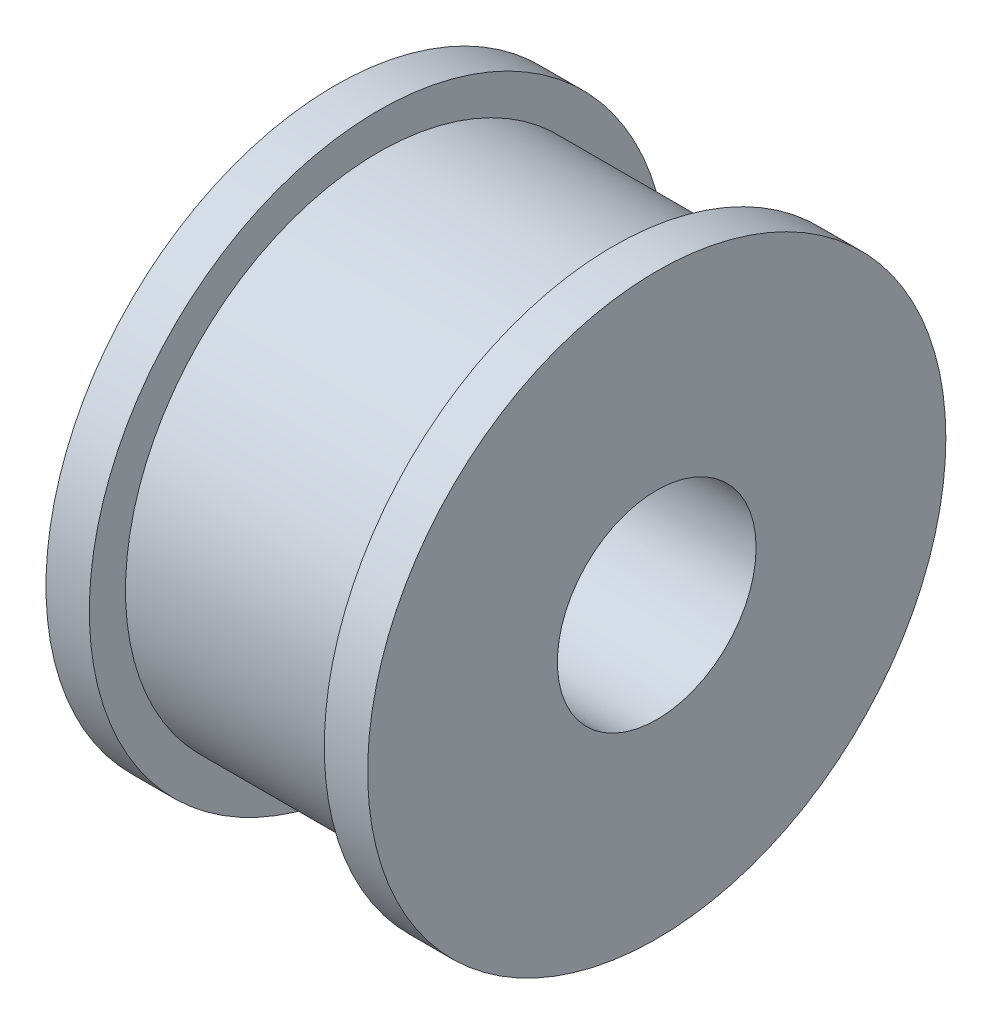
ISO-10303-21;
HEADER;
FILE_DESCRIPTION(('STEP AP214'),'2;1');
FILE_NAME('part.step','',(''),(''),'','','');
FILE_SCHEMA(('AUTOMOTIVE_DESIGN { 1 0 10303 214 1 1 1 1 }'));
ENDSEC;
DATA;
#1=APPLICATION_CONTEXT('core data for automotive mechanical design processes');
#2=APPLICATION_PROTOCOL_DEFINITION('international standard','automotive_design',2000,#1);
#3=PRODUCT_CONTEXT('',#1,'mechanical');
#4=PRODUCT('Part','Part','',(#3));
#5=PRODUCT_RELATED_PRODUCT_CATEGORY('part','',(#4));
#6=PRODUCT_DEFINITION_FORMATION('','',#4);
#7=PRODUCT_DEFINITION_CONTEXT('part definition',#1,'design');
#8=PRODUCT_DEFINITION('design','',#6,#7);
#9=PRODUCT_DEFINITION_SHAPE('','',#8);
#10=(LENGTH_UNIT() NAMED_UNIT(*) SI_UNIT(.MILLI.,.METRE.));
#11=(NAMED_UNIT(*) PLANE_ANGLE_UNIT() SI_UNIT($,.RADIAN.));
#12=(NAMED_UNIT(*) SI_UNIT($,.STERADIAN.) SOLID_ANGLE_UNIT());
#13=UNCERTAINTY_MEASURE_WITH_UNIT(LENGTH_MEASURE(1.E-05),#10,'distance_accuracy_value','');
#14=(GEOMETRIC_REPRESENTATION_CONTEXT(3) GLOBAL_UNCERTAINTY_ASSIGNED_CONTEXT((#13)) GLOBAL_UNIT_ASSIGNED_CONTEXT((#10,
#11,#12)) REPRESENTATION_CONTEXT('',''));
#15=CARTESIAN_POINT('',(0.,0.,0.));
#16=DIRECTION('',(0.,0.,1.));
#17=DIRECTION('',(1.,0.,0.));
#18=AXIS2_PLACEMENT_3D('',#15,#16,#17);
#19=CARTESIAN_POINT('',(-44.5,0.,0.));
#20=DIRECTION('',(-1.,0.,0.));
#21=DIRECTION('',(0.,0.,1.));
#22=AXIS2_PLACEMENT_3D('',#19,#20,#21);
#23=PLANE('',#22);
#24=CARTESIAN_POINT('',(-44.5,0.,0.));
#25=DIRECTION('',(-1.,0.,0.));
#26=DIRECTION('',(0.,0.,1.));
#27=AXIS2_PLACEMENT_3D('',#24,#25,#26);
#28=CIRCLE('',#27,27.5);
#29=CARTESIAN_POINT('',(-44.5,0.,27.5));
#30=VERTEX_POINT('',#29);
#31=EDGE_CURVE('E68',#30,#30,#28,.T.);
#32=ORIENTED_EDGE('',*,*,#31,.F.);
#33=EDGE_LOOP('',(#32));
#34=FACE_BOUND('',#33,.T.);
#35=CARTESIAN_POINT('',(-44.5,0.,0.));
#36=DIRECTION('',(1.,0.,0.));
#37=DIRECTION('',(0.,0.,-1.));
#38=AXIS2_PLACEMENT_3D('',#35,#36,#37);
#39=CIRCLE('',#38,80.);
#40=CARTESIAN_POINT('',(-44.5,0.,-80.));
#41=VERTEX_POINT('',#40);
#42=EDGE_CURVE('E10',#41,#41,#39,.T.);
#43=ORIENTED_EDGE('',*,*,#42,.F.);
#44=EDGE_LOOP('',(#43));
#45=FACE_BOUND('',#44,.T.);
#46=ADVANCED_FACE('F37',(#34,#45),#23,.T.);
#47=CARTESIAN_POINT('',(44.5,0.,0.));
#48=DIRECTION('',(1.,0.,0.));
#49=DIRECTION('',(0.,0.,-1.));
#50=AXIS2_PLACEMENT_3D('',#47,#48,#49);
#51=CYLINDRICAL_SURFACE('',#50,80.);
#52=ORIENTED_EDGE('',*,*,#42,.T.);
#53=EDGE_LOOP('',(#52));
#54=FACE_BOUND('',#53,.T.);
#55=CARTESIAN_POINT('',(-32.5,0.,0.));
#56=DIRECTION('',(1.,0.,0.));
#57=DIRECTION('',(0.,0.,-1.));
#58=AXIS2_PLACEMENT_3D('',#55,#56,#57);
#59=CIRCLE('',#58,80.);
#60=CARTESIAN_POINT('',(-32.5,0.,-80.));
#61=VERTEX_POINT('',#60);
#62=EDGE_CURVE('E45',#61,#61,#59,.T.);
#63=ORIENTED_EDGE('',*,*,#62,.F.);
#64=EDGE_LOOP('',(#63));
#65=FACE_BOUND('',#64,.T.);
#66=ADVANCED_FACE('F97',(#54,#65),#51,.T.);
#67=CARTESIAN_POINT('',(-32.5,0.,-80.));
#68=DIRECTION('',(1.,0.,0.));
#69=DIRECTION('',(0.,0.,-1.));
#70=AXIS2_PLACEMENT_3D('',#67,#68,#69);
#71=PLANE('',#70);
#72=ORIENTED_EDGE('',*,*,#62,.T.);
#73=EDGE_LOOP('',(#72));
#74=FACE_BOUND('',#73,.T.);
#75=CARTESIAN_POINT('',(-32.5,0.,0.));
#76=DIRECTION('',(1.,0.,0.));
#77=DIRECTION('',(0.,0.,-1.));
#78=AXIS2_PLACEMENT_3D('',#75,#76,#77);
#79=CIRCLE('',#78,70.);
#80=CARTESIAN_POINT('',(-32.5,0.,-70.));
#81=VERTEX_POINT('',#80);
#82=EDGE_CURVE('E50',#81,#81,#79,.T.);
#83=ORIENTED_EDGE('',*,*,#82,.F.);
#84=EDGE_LOOP('',(#83));
#85=FACE_BOUND('',#84,.T.);
#86=ADVANCED_FACE('F102',(#74,#85),#71,.T.);
#87=CARTESIAN_POINT('',(44.5,0.,0.));
#88=DIRECTION('',(1.,0.,0.));
#89=DIRECTION('',(0.,0.,-1.));
#90=AXIS2_PLACEMENT_3D('',#87,#88,#89);
#91=CYLINDRICAL_SURFACE('',#90,70.);
#92=ORIENTED_EDGE('',*,*,#82,.T.);
#93=EDGE_LOOP('',(#92));
#94=FACE_BOUND('',#93,.T.);
#95=CARTESIAN_POINT('',(32.5,0.,0.));
#96=DIRECTION('',(1.,0.,0.));
#97=DIRECTION('',(0.,0.,-1.));
#98=AXIS2_PLACEMENT_3D('',#95,#96,#97);
#99=CIRCLE('',#98,70.);
#100=CARTESIAN_POINT('',(32.5,0.,-70.));
#101=VERTEX_POINT('',#100);
#102=EDGE_CURVE('E56',#101,#101,#99,.T.);
#103=ORIENTED_EDGE('',*,*,#102,.F.);
#104=EDGE_LOOP('',(#103));
#105=FACE_BOUND('',#104,.T.);
#106=ADVANCED_FACE('F93',(#94,#105),#91,.T.);
#107=CARTESIAN_POINT('',(32.5,0.,-80.));
#108=DIRECTION('',(-1.,0.,0.));
#109=DIRECTION('',(0.,0.,1.));
#110=AXIS2_PLACEMENT_3D('',#107,#108,#109);
#111=PLANE('',#110);
#112=ORIENTED_EDGE('',*,*,#102,.T.);
#113=EDGE_LOOP('',(#112));
#114=FACE_BOUND('',#113,.T.);
#115=CARTESIAN_POINT('',(32.5,0.,0.));
#116=DIRECTION('',(1.,0.,0.));
#117=DIRECTION('',(0.,0.,-1.));
#118=AXIS2_PLACEMENT_3D('',#115,#116,#117);
#119=CIRCLE('',#118,80.);
#120=CARTESIAN_POINT('',(32.5,0.,-80.));
#121=VERTEX_POINT('',#120);
#122=EDGE_CURVE('E60',#121,#121,#119,.T.);
#123=ORIENTED_EDGE('',*,*,#122,.F.);
#124=EDGE_LOOP('',(#123));
#125=FACE_BOUND('',#124,.T.);
#126=ADVANCED_FACE('F87',(#114,#125),#111,.T.);
#127=CARTESIAN_POINT('',(44.5,0.,0.));
#128=DIRECTION('',(1.,0.,0.));
#129=DIRECTION('',(0.,0.,-1.));
#130=AXIS2_PLACEMENT_3D('',#127,#128,#129);
#131=CYLINDRICAL_SURFACE('',#130,80.);
#132=ORIENTED_EDGE('',*,*,#122,.T.);
#133=EDGE_LOOP('',(#132));
#134=FACE_BOUND('',#133,.T.);
#135=CARTESIAN_POINT('',(44.5,0.,0.));
#136=DIRECTION('',(1.,0.,0.));
#137=DIRECTION('',(0.,0.,-1.));
#138=AXIS2_PLACEMENT_3D('',#135,#136,#137);
#139=CIRCLE('',#138,80.);
#140=CARTESIAN_POINT('',(44.5,0.,-80.));
#141=VERTEX_POINT('',#140);
#142=EDGE_CURVE('E64',#141,#141,#139,.T.);
#143=ORIENTED_EDGE('',*,*,#142,.F.);
#144=EDGE_LOOP('',(#143));
#145=FACE_BOUND('',#144,.T.);
#146=ADVANCED_FACE('F82',(#134,#145),#131,.T.);
#147=CARTESIAN_POINT('',(44.5,0.,0.));
#148=DIRECTION('',(1.,0.,0.));
#149=DIRECTION('',(0.,0.,-1.));
#150=AXIS2_PLACEMENT_3D('',#147,#148,#149);
#151=PLANE('',#150);
#152=CARTESIAN_POINT('',(44.5,0.,0.));
#153=DIRECTION('',(1.,0.,0.));
#154=DIRECTION('',(0.,0.,-1.));
#155=AXIS2_PLACEMENT_3D('',#152,#153,#154);
#156=CIRCLE('',#155,27.5);
#157=CARTESIAN_POINT('',(44.5,0.,-27.5));
#158=VERTEX_POINT('',#157);
#159=EDGE_CURVE('E40',#158,#158,#156,.T.);
#160=ORIENTED_EDGE('',*,*,#159,.F.);
#161=EDGE_LOOP('',(#160));
#162=FACE_BOUND('',#161,.T.);
#163=ORIENTED_EDGE('',*,*,#142,.T.);
#164=EDGE_LOOP('',(#163));
#165=FACE_BOUND('',#164,.T.);
#166=ADVANCED_FACE('F79',(#162,#165),#151,.T.);
#167=CARTESIAN_POINT('',(-55.,0.,0.));
#168=DIRECTION('',(1.,0.,0.));
#169=DIRECTION('',(0.,0.,-1.));
#170=AXIS2_PLACEMENT_3D('',#167,#168,#169);
#171=CYLINDRICAL_SURFACE('',#170,27.5);
#172=ORIENTED_EDGE('',*,*,#31,.T.);
#173=EDGE_LOOP('',(#172));
#174=FACE_BOUND('',#173,.T.);
#175=ORIENTED_EDGE('',*,*,#159,.T.);
#176=EDGE_LOOP('',(#175));
#177=FACE_BOUND('',#176,.T.);
#178=ADVANCED_FACE('F77',(#174,#177),#171,.F.);
#179=CLOSED_SHELL('',(#46,#66,#86,#106,#126,#146,#166,#178));
#180=MANIFOLD_SOLID_BREP('B2',#179);
#181=ADVANCED_BREP_SHAPE_REPRESENTATION('',(#18,#180),#14);
#182=SHAPE_DEFINITION_REPRESENTATION(#9,#181);
ENDSEC;
END-ISO-10303-21;
